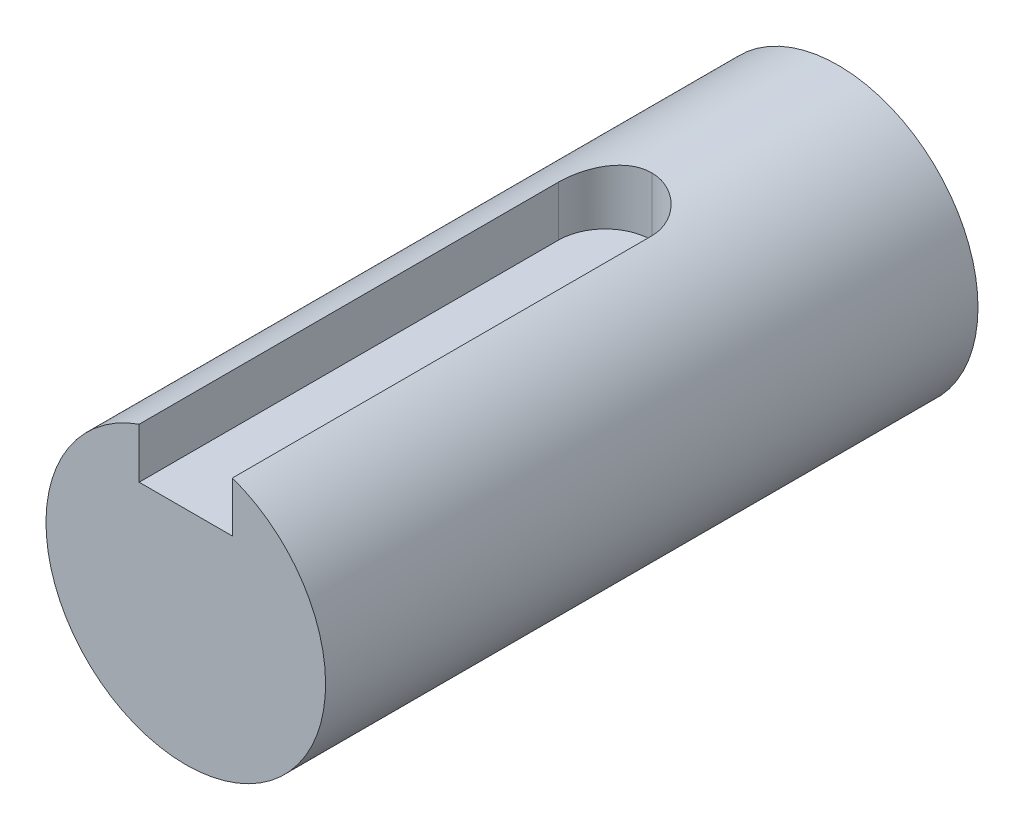
ISO-10303-21;
HEADER;
FILE_DESCRIPTION(('STEP AP214'),'2;1');
FILE_NAME('part.step','',(''),(''),'','','');
FILE_SCHEMA(('AUTOMOTIVE_DESIGN { 1 0 10303 214 1 1 1 1 }'));
ENDSEC;
DATA;
#1=APPLICATION_CONTEXT('core data for automotive mechanical design processes');
#2=APPLICATION_PROTOCOL_DEFINITION('international standard','automotive_design',2000,#1);
#3=PRODUCT_CONTEXT('',#1,'mechanical');
#4=PRODUCT('Part','Part','',(#3));
#5=PRODUCT_RELATED_PRODUCT_CATEGORY('part','',(#4));
#6=PRODUCT_DEFINITION_FORMATION('','',#4);
#7=PRODUCT_DEFINITION_CONTEXT('part definition',#1,'design');
#8=PRODUCT_DEFINITION('design','',#6,#7);
#9=PRODUCT_DEFINITION_SHAPE('','',#8);
#10=(LENGTH_UNIT() NAMED_UNIT(*) SI_UNIT(.MILLI.,.METRE.));
#11=(NAMED_UNIT(*) PLANE_ANGLE_UNIT() SI_UNIT($,.RADIAN.));
#12=(NAMED_UNIT(*) SI_UNIT($,.STERADIAN.) SOLID_ANGLE_UNIT());
#13=UNCERTAINTY_MEASURE_WITH_UNIT(LENGTH_MEASURE(1.E-05),#10,'distance_accuracy_value','');
#14=(GEOMETRIC_REPRESENTATION_CONTEXT(3) GLOBAL_UNCERTAINTY_ASSIGNED_CONTEXT((#13)) GLOBAL_UNIT_ASSIGNED_CONTEXT((#10,
#11,#12)) REPRESENTATION_CONTEXT('',''));
#15=CARTESIAN_POINT('',(0.,0.,0.));
#16=DIRECTION('',(0.,0.,1.));
#17=DIRECTION('',(1.,0.,0.));
#18=AXIS2_PLACEMENT_3D('',#15,#16,#17);
#19=CARTESIAN_POINT('',(0.,0.,28.));
#20=DIRECTION('',(0.,0.,-1.));
#21=DIRECTION('',(-1.,0.,0.));
#22=AXIS2_PLACEMENT_3D('',#19,#20,#21);
#23=CYLINDRICAL_SURFACE('',#22,6.);
#24=CARTESIAN_POINT('',(-2.,5.65685424949238,10.));
#25=CARTESIAN_POINT('',(-2.00000149512875,5.65684884044384,9.94541704377442));
#26=CARTESIAN_POINT('',(-1.99776408811042,5.65764525554432,9.89086195023326));
#27=CARTESIAN_POINT('',(-1.9888504135534,5.66078682779709,9.78217503261047));
#28=CARTESIAN_POINT('',(-1.98217534484155,5.66313156667118,9.72804309820794));
#29=CARTESIAN_POINT('',(-1.95561944707209,5.67238249944943,9.56720809882408));
#30=CARTESIAN_POINT('',(-1.92920720626658,5.68150626562378,9.46163461319581));
#31=CARTESIAN_POINT('',(-1.85991745495775,5.70456128746234,9.25675145099974));
#32=CARTESIAN_POINT('',(-1.81704873161974,5.71848997706988,9.15743846444408));
#33=CARTESIAN_POINT('',(-1.71614848260143,5.74957513589614,8.96732356474951));
#34=CARTESIAN_POINT('',(-1.65810710789689,5.76673369969067,8.87652723223936));
#35=CARTESIAN_POINT('',(-1.52610377651105,5.80308937108513,8.70256063857767));
#36=CARTESIAN_POINT('',(-1.45165244068241,5.82233703768638,8.61977237084186));
#37=CARTESIAN_POINT('',(-1.28997832649464,5.86027657241026,8.4675895231524));
#38=CARTESIAN_POINT('',(-1.20275297076722,5.87896832745079,8.39819765270751));
#39=CARTESIAN_POINT('',(-1.01517948465836,5.91428318381102,8.27302116127825));
#40=CARTESIAN_POINT('',(-0.914545563743607,5.93083859435838,8.21764442277943));
#41=CARTESIAN_POINT('',(-0.704778382416404,5.95940068054705,8.12478944654094));
#42=CARTESIAN_POINT('',(-0.595653246788261,5.97141164153878,8.08729433794607));
#43=CARTESIAN_POINT('',(-0.405039938308067,5.98683638460032,8.03975449692093));
#44=CARTESIAN_POINT('',(-0.324844137200844,5.99173893748046,8.02488246442356));
#45=CARTESIAN_POINT('',(-0.163116338418334,5.99833589860542,8.00499227649776));
#46=CARTESIAN_POINT('',(-0.0815843983719449,6.00003044484911,7.99997369720285));
#47=CARTESIAN_POINT('',(0.,6.,8.));
#48=B_SPLINE_CURVE_WITH_KNOTS('',3,(#24,#25,#26,#27,#28,#29,#30,#31,#32,#33,#34,#35,#36,#37,#38,
#39,#40,#41,#42,#43,#44,#45,#46,#47),.UNSPECIFIED.,.F.,.F.,(4,2,2,2,2,2,2,2,2,2,2,4),(0.,
0.163642852274036,0.327241514661661,0.653162428346642,0.978909553601299,1.30486865846291,
1.6423260531075,1.97985162936957,2.32629350373383,2.67240786933103,2.91690407760369,
3.16138976814069),.UNSPECIFIED.);
#49=CARTESIAN_POINT('',(-2.,5.65685424949238,10.));
#50=VERTEX_POINT('',#49);
#51=CARTESIAN_POINT('',(0.,6.,8.));
#52=VERTEX_POINT('',#51);
#53=EDGE_CURVE('E134',#50,#52,#48,.T.);
#54=ORIENTED_EDGE('',*,*,#53,.T.);
#55=CARTESIAN_POINT('',(0.,6.,8.));
#56=CARTESIAN_POINT('',(0.0546683631627463,6.00000404089062,7.99999873174655));
#57=CARTESIAN_POINT('',(0.109309162120527,5.99925195481406,8.00224293037414));
#58=CARTESIAN_POINT('',(0.218172447869438,5.99627870449675,8.01118513442742));
#59=CARTESIAN_POINT('',(0.272395027818756,5.9940578775742,8.01788211720685));
#60=CARTESIAN_POINT('',(0.433534341631828,5.98527797188061,8.04453291827431));
#61=CARTESIAN_POINT('',(0.539328021269889,5.97660083004632,8.07104723437087));
#62=CARTESIAN_POINT('',(0.744665042939682,5.9545081623258,8.14063364010546));
#63=CARTESIAN_POINT('',(0.844210598979025,5.9410943261676,8.18369982565409));
#64=CARTESIAN_POINT('',(1.03471474954662,5.91089451706747,8.28506249680265));
#65=CARTESIAN_POINT('',(1.12566873697787,5.89410674982767,8.34336709135318));
#66=CARTESIAN_POINT('',(1.29948093863748,5.8582826684853,8.47564872641775));
#67=CARTESIAN_POINT('',(1.38200074847599,5.83919277995621,8.55005560718188));
#68=CARTESIAN_POINT('',(1.53365940373568,5.80120781115016,8.71152771928069));
#69=CARTESIAN_POINT('',(1.60279418762802,5.78231279164535,8.79859677881414));
#70=CARTESIAN_POINT('',(1.72767345021022,5.74625995358262,8.98600355299774));
#71=CARTESIAN_POINT('',(1.78296972769266,5.72916868794963,9.08665365423166));
#72=CARTESIAN_POINT('',(1.87566814457852,5.69949566482247,9.29644530642697));
#73=CARTESIAN_POINT('',(1.91308921632305,5.68690913973841,9.40557773029373));
#74=CARTESIAN_POINT('',(1.96044888052846,5.67072125854744,9.59599476921402));
#75=CARTESIAN_POINT('',(1.97524208385272,5.66556351059962,9.67597103268996));
#76=CARTESIAN_POINT('',(1.99503182962533,5.6586108534274,9.83727948336657));
#77=CARTESIAN_POINT('',(2.00002685941071,5.6568164634473,9.91861187797532));
#78=CARTESIAN_POINT('',(2.,5.65685424949238,10.));
#79=B_SPLINE_CURVE_WITH_KNOTS('',3,(#55,#56,#57,#58,#59,#60,#61,#62,#63,#64,#65,#66,#67,#68,#69,
#70,#71,#72,#73,#74,#75,#76,#77,#78),.UNSPECIFIED.,.F.,.F.,(4,2,2,2,2,2,2,2,2,2,2,4),(0.,
0.163899900403194,0.327762171820578,0.654286706665199,0.980694877403359,1.30727709754284,
1.64398404745258,1.98079300754891,2.32740309483894,2.67364525512364,2.91749818976318,
3.16138876797768),.UNSPECIFIED.);
#80=CARTESIAN_POINT('',(2.,5.65685424949238,10.));
#81=VERTEX_POINT('',#80);
#82=EDGE_CURVE('E11',#52,#81,#79,.T.);
#83=ORIENTED_EDGE('',*,*,#82,.T.);
#84=DIRECTION('',(0.,0.,-1.));
#85=VECTOR('',#84,1.);
#86=CARTESIAN_POINT('',(2.,5.65685424949238,28.));
#87=LINE('',#86,#85);
#88=CARTESIAN_POINT('',(2.,5.65685424949238,28.));
#89=VERTEX_POINT('',#88);
#90=EDGE_CURVE('E123',#81,#89,#87,.F.);
#91=ORIENTED_EDGE('',*,*,#90,.T.);
#92=CARTESIAN_POINT('',(0.,0.,28.));
#93=DIRECTION('',(0.,0.,1.));
#94=DIRECTION('',(1.,0.,0.));
#95=AXIS2_PLACEMENT_3D('',#92,#93,#94);
#96=CIRCLE('',#95,6.);
#97=CARTESIAN_POINT('',(-2.,5.65685424949238,28.));
#98=VERTEX_POINT('',#97);
#99=EDGE_CURVE('E113',#98,#89,#96,.T.);
#100=ORIENTED_EDGE('',*,*,#99,.F.);
#101=DIRECTION('',(0.,0.,-1.));
#102=VECTOR('',#101,1.);
#103=CARTESIAN_POINT('',(-2.,5.65685424949238,28.));
#104=LINE('',#103,#102);
#105=EDGE_CURVE('E108',#98,#50,#104,.T.);
#106=ORIENTED_EDGE('',*,*,#105,.T.);
#107=EDGE_LOOP('',(#54,#83,#91,#100,#106));
#108=FACE_BOUND('',#107,.T.);
#109=CARTESIAN_POINT('',(0.,0.,0.));
#110=DIRECTION('',(0.,0.,1.));
#111=DIRECTION('',(1.,0.,0.));
#112=AXIS2_PLACEMENT_3D('',#109,#110,#111);
#113=CIRCLE('',#112,6.);
#114=CARTESIAN_POINT('',(6.,0.,0.));
#115=VERTEX_POINT('',#114);
#116=EDGE_CURVE('E125',#115,#115,#113,.T.);
#117=ORIENTED_EDGE('',*,*,#116,.T.);
#118=EDGE_LOOP('',(#117));
#119=FACE_BOUND('',#118,.T.);
#120=ADVANCED_FACE('F41',(#108,#119),#23,.T.);
#121=CARTESIAN_POINT('',(0.,0.,28.));
#122=DIRECTION('',(0.,0.,1.));
#123=DIRECTION('',(1.,0.,0.));
#124=AXIS2_PLACEMENT_3D('',#121,#122,#123);
#125=PLANE('',#124);
#126=DIRECTION('',(0.,1.,0.));
#127=VECTOR('',#126,1.);
#128=CARTESIAN_POINT('',(2.,3.5,28.));
#129=LINE('',#128,#127);
#130=CARTESIAN_POINT('',(2.,3.5,28.));
#131=VERTEX_POINT('',#130);
#132=EDGE_CURVE('E117',#131,#89,#129,.T.);
#133=ORIENTED_EDGE('',*,*,#132,.F.);
#134=DIRECTION('',(1.,0.,0.));
#135=VECTOR('',#134,1.);
#136=CARTESIAN_POINT('',(2.,3.5,28.));
#137=LINE('',#136,#135);
#138=CARTESIAN_POINT('',(-2.,3.5,28.));
#139=VERTEX_POINT('',#138);
#140=EDGE_CURVE('E96',#139,#131,#137,.T.);
#141=ORIENTED_EDGE('',*,*,#140,.F.);
#142=DIRECTION('',(0.,-1.,0.));
#143=VECTOR('',#142,1.);
#144=CARTESIAN_POINT('',(-2.,0.,28.));
#145=LINE('',#144,#143);
#146=EDGE_CURVE('E105',#98,#139,#145,.T.);
#147=ORIENTED_EDGE('',*,*,#146,.F.);
#148=ORIENTED_EDGE('',*,*,#99,.T.);
#149=EDGE_LOOP('',(#133,#141,#147,#148));
#150=FACE_BOUND('',#149,.T.);
#151=ADVANCED_FACE('F115',(#150),#125,.T.);
#152=CARTESIAN_POINT('',(0.,0.,0.));
#153=DIRECTION('',(0.,0.,1.));
#154=DIRECTION('',(1.,0.,0.));
#155=AXIS2_PLACEMENT_3D('',#152,#153,#154);
#156=PLANE('',#155);
#157=ORIENTED_EDGE('',*,*,#116,.F.);
#158=EDGE_LOOP('',(#157));
#159=FACE_BOUND('',#158,.T.);
#160=ADVANCED_FACE('F159',(#159),#156,.F.);
#161=CARTESIAN_POINT('',(2.,3.5,8.));
#162=DIRECTION('',(1.,0.,0.));
#163=DIRECTION('',(0.,1.,0.));
#164=AXIS2_PLACEMENT_3D('',#161,#162,#163);
#165=PLANE('',#164);
#166=ORIENTED_EDGE('',*,*,#90,.F.);
#167=DIRECTION('',(0.,1.,0.));
#168=VECTOR('',#167,1.);
#169=CARTESIAN_POINT('',(2.,3.5,10.));
#170=LINE('',#169,#168);
#171=CARTESIAN_POINT('',(2.,3.5,10.));
#172=VERTEX_POINT('',#171);
#173=EDGE_CURVE('E67',#81,#172,#170,.F.);
#174=ORIENTED_EDGE('',*,*,#173,.T.);
#175=DIRECTION('',(0.,0.,1.));
#176=VECTOR('',#175,1.);
#177=CARTESIAN_POINT('',(2.,3.5,8.));
#178=LINE('',#177,#176);
#179=EDGE_CURVE('E102',#172,#131,#178,.T.);
#180=ORIENTED_EDGE('',*,*,#179,.T.);
#181=ORIENTED_EDGE('',*,*,#132,.T.);
#182=EDGE_LOOP('',(#166,#174,#180,#181));
#183=FACE_BOUND('',#182,.T.);
#184=ADVANCED_FACE('F166',(#183),#165,.F.);
#185=CARTESIAN_POINT('',(-2.,3.5,8.));
#186=DIRECTION('',(-1.,0.,0.));
#187=DIRECTION('',(0.,0.,1.));
#188=AXIS2_PLACEMENT_3D('',#185,#186,#187);
#189=PLANE('',#188);
#190=DIRECTION('',(0.,0.,1.));
#191=VECTOR('',#190,1.);
#192=CARTESIAN_POINT('',(-2.,3.5,8.));
#193=LINE('',#192,#191);
#194=CARTESIAN_POINT('',(-2.,3.5,10.));
#195=VERTEX_POINT('',#194);
#196=EDGE_CURVE('E92',#195,#139,#193,.T.);
#197=ORIENTED_EDGE('',*,*,#196,.F.);
#198=DIRECTION('',(0.,-1.,0.));
#199=VECTOR('',#198,1.);
#200=CARTESIAN_POINT('',(-2.,3.5,10.));
#201=LINE('',#200,#199);
#202=EDGE_CURVE('E132',#195,#50,#201,.F.);
#203=ORIENTED_EDGE('',*,*,#202,.T.);
#204=ORIENTED_EDGE('',*,*,#105,.F.);
#205=ORIENTED_EDGE('',*,*,#146,.T.);
#206=EDGE_LOOP('',(#197,#203,#204,#205));
#207=FACE_BOUND('',#206,.T.);
#208=ADVANCED_FACE('F106',(#207),#189,.F.);
#209=CARTESIAN_POINT('',(2.,3.5,8.));
#210=DIRECTION('',(0.,-1.,0.));
#211=DIRECTION('',(1.,0.,0.));
#212=AXIS2_PLACEMENT_3D('',#209,#210,#211);
#213=PLANE('',#212);
#214=ORIENTED_EDGE('',*,*,#179,.F.);
#215=CARTESIAN_POINT('',(0.,3.5,10.));
#216=DIRECTION('',(0.,-1.,0.));
#217=DIRECTION('',(1.,0.,0.));
#218=AXIS2_PLACEMENT_3D('',#215,#216,#217);
#219=CIRCLE('',#218,2.);
#220=CARTESIAN_POINT('',(0.,3.5,8.));
#221=VERTEX_POINT('',#220);
#222=EDGE_CURVE('E55',#172,#221,#219,.F.);
#223=ORIENTED_EDGE('',*,*,#222,.T.);
#224=CARTESIAN_POINT('',(0.,3.5,10.));
#225=DIRECTION('',(0.,-1.,0.));
#226=DIRECTION('',(1.,0.,0.));
#227=AXIS2_PLACEMENT_3D('',#224,#225,#226);
#228=CIRCLE('',#227,2.);
#229=EDGE_CURVE('E99',#221,#195,#228,.F.);
#230=ORIENTED_EDGE('',*,*,#229,.T.);
#231=ORIENTED_EDGE('',*,*,#196,.T.);
#232=ORIENTED_EDGE('',*,*,#140,.T.);
#233=EDGE_LOOP('',(#214,#223,#230,#231,#232));
#234=FACE_BOUND('',#233,.T.);
#235=ADVANCED_FACE('F94',(#234),#213,.F.);
#236=CARTESIAN_POINT('',(0.,0.,10.));
#237=DIRECTION('',(0.,-1.,0.));
#238=DIRECTION('',(0.,0.,-1.));
#239=AXIS2_PLACEMENT_3D('',#236,#237,#238);
#240=CYLINDRICAL_SURFACE('',#239,2.);
#241=ORIENTED_EDGE('',*,*,#53,.F.);
#242=ORIENTED_EDGE('',*,*,#202,.F.);
#243=ORIENTED_EDGE('',*,*,#229,.F.);
#244=DIRECTION('',(0.,-1.,0.));
#245=VECTOR('',#244,1.);
#246=CARTESIAN_POINT('',(0.,0.,8.));
#247=LINE('',#246,#245);
#248=EDGE_CURVE('E112',#52,#221,#247,.T.);
#249=ORIENTED_EDGE('',*,*,#248,.F.);
#250=EDGE_LOOP('',(#241,#242,#243,#249));
#251=FACE_BOUND('',#250,.T.);
#252=ADVANCED_FACE('F142',(#251),#240,.F.);
#253=CARTESIAN_POINT('',(0.,0.,10.));
#254=DIRECTION('',(0.,1.,0.));
#255=DIRECTION('',(-1.,0.,0.));
#256=AXIS2_PLACEMENT_3D('',#253,#254,#255);
#257=CYLINDRICAL_SURFACE('',#256,2.);
#258=ORIENTED_EDGE('',*,*,#222,.F.);
#259=ORIENTED_EDGE('',*,*,#173,.F.);
#260=ORIENTED_EDGE('',*,*,#82,.F.);
#261=ORIENTED_EDGE('',*,*,#248,.T.);
#262=EDGE_LOOP('',(#258,#259,#260,#261));
#263=FACE_BOUND('',#262,.T.);
#264=ADVANCED_FACE('F43',(#263),#257,.F.);
#265=CLOSED_SHELL('',(#120,#151,#160,#184,#208,#235,#252,#264));
#266=MANIFOLD_SOLID_BREP('B2',#265);
#267=ADVANCED_BREP_SHAPE_REPRESENTATION('',(#18,#266),#14);
#268=SHAPE_DEFINITION_REPRESENTATION(#9,#267);
ENDSEC;
END-ISO-10303-21;
